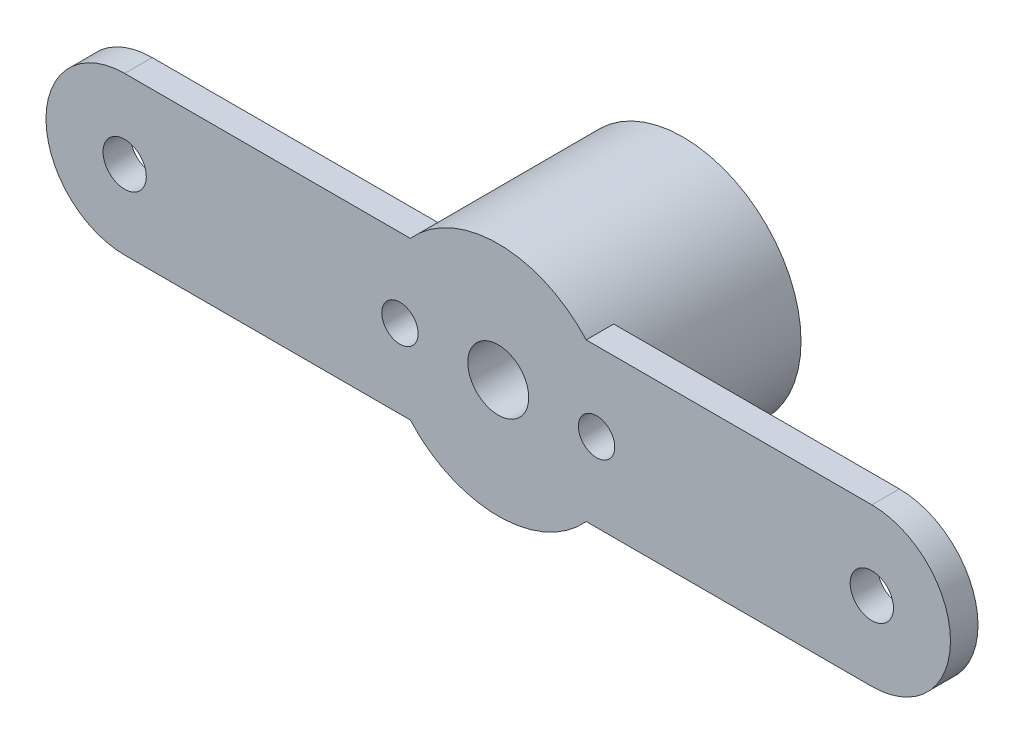
ISO-10303-21;
HEADER;
FILE_DESCRIPTION(('STEP AP214'),'2;1');
FILE_NAME('part.step','',(''),(''),'','','');
FILE_SCHEMA(('AUTOMOTIVE_DESIGN { 1 0 10303 214 1 1 1 1 }'));
ENDSEC;
DATA;
#1=APPLICATION_CONTEXT('core data for automotive mechanical design processes');
#2=APPLICATION_PROTOCOL_DEFINITION('international standard','automotive_design',2000,#1);
#3=PRODUCT_CONTEXT('',#1,'mechanical');
#4=PRODUCT('Part','Part','',(#3));
#5=PRODUCT_RELATED_PRODUCT_CATEGORY('part','',(#4));
#6=PRODUCT_DEFINITION_FORMATION('','',#4);
#7=PRODUCT_DEFINITION_CONTEXT('part definition',#1,'design');
#8=PRODUCT_DEFINITION('design','',#6,#7);
#9=PRODUCT_DEFINITION_SHAPE('','',#8);
#10=(LENGTH_UNIT() NAMED_UNIT(*) SI_UNIT(.MILLI.,.METRE.));
#11=(NAMED_UNIT(*) PLANE_ANGLE_UNIT() SI_UNIT($,.RADIAN.));
#12=(NAMED_UNIT(*) SI_UNIT($,.STERADIAN.) SOLID_ANGLE_UNIT());
#13=UNCERTAINTY_MEASURE_WITH_UNIT(LENGTH_MEASURE(1.E-05),#10,'distance_accuracy_value','');
#14=(GEOMETRIC_REPRESENTATION_CONTEXT(3) GLOBAL_UNCERTAINTY_ASSIGNED_CONTEXT((#13)) GLOBAL_UNIT_ASSIGNED_CONTEXT((#10,
#11,#12)) REPRESENTATION_CONTEXT('',''));
#15=CARTESIAN_POINT('',(0.,0.,0.));
#16=DIRECTION('',(0.,0.,1.));
#17=DIRECTION('',(1.,0.,0.));
#18=AXIS2_PLACEMENT_3D('',#15,#16,#17);
#19=CARTESIAN_POINT('',(-19.,0.,0.));
#20=DIRECTION('',(0.,0.,1.));
#21=DIRECTION('',(1.,0.,0.));
#22=AXIS2_PLACEMENT_3D('',#19,#20,#21);
#23=PLANE('',#22);
#24=CARTESIAN_POINT('',(0.,0.,0.));
#25=DIRECTION('',(0.,0.,-1.));
#26=DIRECTION('',(-1.,0.,0.));
#27=AXIS2_PLACEMENT_3D('',#24,#25,#26);
#28=CIRCLE('',#27,6.);
#29=CARTESIAN_POINT('',(4.47213595499958,4.,0.));
#30=VERTEX_POINT('',#29);
#31=CARTESIAN_POINT('',(4.47213595499958,-4.,0.));
#32=VERTEX_POINT('',#31);
#33=EDGE_CURVE('E11',#30,#32,#28,.T.);
#34=ORIENTED_EDGE('',*,*,#33,.F.);
#35=DIRECTION('',(-1.,0.,0.));
#36=VECTOR('',#35,1.);
#37=CARTESIAN_POINT('',(4.47213595499958,4.,0.));
#38=LINE('',#37,#36);
#39=CARTESIAN_POINT('',(19.,4.,0.));
#40=VERTEX_POINT('',#39);
#41=EDGE_CURVE('E127',#40,#30,#38,.T.);
#42=ORIENTED_EDGE('',*,*,#41,.F.);
#43=CARTESIAN_POINT('',(19.,0.,0.));
#44=DIRECTION('',(0.,0.,1.));
#45=DIRECTION('',(1.,0.,0.));
#46=AXIS2_PLACEMENT_3D('',#43,#44,#45);
#47=CIRCLE('',#46,4.);
#48=CARTESIAN_POINT('',(19.,-4.,0.));
#49=VERTEX_POINT('',#48);
#50=EDGE_CURVE('E144',#49,#40,#47,.T.);
#51=ORIENTED_EDGE('',*,*,#50,.F.);
#52=DIRECTION('',(1.,0.,0.));
#53=VECTOR('',#52,1.);
#54=CARTESIAN_POINT('',(4.47213595499958,-4.,0.));
#55=LINE('',#54,#53);
#56=EDGE_CURVE('E146',#32,#49,#55,.T.);
#57=ORIENTED_EDGE('',*,*,#56,.F.);
#58=EDGE_LOOP('',(#34,#42,#51,#57));
#59=FACE_BOUND('',#58,.T.);
#60=CARTESIAN_POINT('',(19.,0.,0.));
#61=DIRECTION('',(0.,0.,1.));
#62=DIRECTION('',(1.,0.,0.));
#63=AXIS2_PLACEMENT_3D('',#60,#61,#62);
#64=CIRCLE('',#63,1.1);
#65=CARTESIAN_POINT('',(20.1,0.,0.));
#66=VERTEX_POINT('',#65);
#67=EDGE_CURVE('E207',#66,#66,#64,.T.);
#68=ORIENTED_EDGE('',*,*,#67,.T.);
#69=EDGE_LOOP('',(#68));
#70=FACE_BOUND('',#69,.T.);
#71=ADVANCED_FACE('F37',(#59,#70),#23,.F.);
#72=CARTESIAN_POINT('',(-19.,0.,1.4));
#73=DIRECTION('',(0.,0.,1.));
#74=DIRECTION('',(1.,0.,0.));
#75=AXIS2_PLACEMENT_3D('',#72,#73,#74);
#76=PLANE('',#75);
#77=CARTESIAN_POINT('',(-5.,0.,1.4));
#78=DIRECTION('',(0.,0.,1.));
#79=DIRECTION('',(1.,0.,0.));
#80=AXIS2_PLACEMENT_3D('',#77,#78,#79);
#81=CIRCLE('',#80,0.925);
#82=CARTESIAN_POINT('',(-4.075,0.,1.4));
#83=VERTEX_POINT('',#82);
#84=EDGE_CURVE('E218',#83,#83,#81,.T.);
#85=ORIENTED_EDGE('',*,*,#84,.F.);
#86=EDGE_LOOP('',(#85));
#87=FACE_BOUND('',#86,.T.);
#88=CARTESIAN_POINT('',(19.,0.,1.4));
#89=DIRECTION('',(0.,0.,1.));
#90=DIRECTION('',(1.,0.,0.));
#91=AXIS2_PLACEMENT_3D('',#88,#89,#90);
#92=CIRCLE('',#91,1.1);
#93=CARTESIAN_POINT('',(20.1,0.,1.4));
#94=VERTEX_POINT('',#93);
#95=EDGE_CURVE('E209',#94,#94,#92,.T.);
#96=ORIENTED_EDGE('',*,*,#95,.F.);
#97=EDGE_LOOP('',(#96));
#98=FACE_BOUND('',#97,.T.);
#99=CARTESIAN_POINT('',(-19.,0.,1.4));
#100=DIRECTION('',(0.,0.,1.));
#101=DIRECTION('',(1.,0.,0.));
#102=AXIS2_PLACEMENT_3D('',#99,#100,#101);
#103=CIRCLE('',#102,4.);
#104=CARTESIAN_POINT('',(-19.,4.,1.4));
#105=VERTEX_POINT('',#104);
#106=CARTESIAN_POINT('',(-19.,-4.,1.4));
#107=VERTEX_POINT('',#106);
#108=EDGE_CURVE('E185',#105,#107,#103,.T.);
#109=ORIENTED_EDGE('',*,*,#108,.T.);
#110=DIRECTION('',(1.,0.,0.));
#111=VECTOR('',#110,1.);
#112=CARTESIAN_POINT('',(-19.,-4.,1.4));
#113=LINE('',#112,#111);
#114=CARTESIAN_POINT('',(-4.47213595499958,-4.,1.4));
#115=VERTEX_POINT('',#114);
#116=EDGE_CURVE('E97',#107,#115,#113,.T.);
#117=ORIENTED_EDGE('',*,*,#116,.T.);
#118=CARTESIAN_POINT('',(0.,0.,1.4));
#119=DIRECTION('',(0.,0.,1.));
#120=DIRECTION('',(1.,0.,0.));
#121=AXIS2_PLACEMENT_3D('',#118,#119,#120);
#122=CIRCLE('',#121,6.);
#123=CARTESIAN_POINT('',(4.47213595499958,-4.,1.4));
#124=VERTEX_POINT('',#123);
#125=EDGE_CURVE('E189',#115,#124,#122,.T.);
#126=ORIENTED_EDGE('',*,*,#125,.T.);
#127=DIRECTION('',(1.,0.,0.));
#128=VECTOR('',#127,1.);
#129=CARTESIAN_POINT('',(4.47213595499958,-4.,1.4));
#130=LINE('',#129,#128);
#131=CARTESIAN_POINT('',(19.,-4.,1.4));
#132=VERTEX_POINT('',#131);
#133=EDGE_CURVE('E195',#124,#132,#130,.T.);
#134=ORIENTED_EDGE('',*,*,#133,.T.);
#135=CARTESIAN_POINT('',(19.,0.,1.4));
#136=DIRECTION('',(0.,0.,1.));
#137=DIRECTION('',(1.,0.,0.));
#138=AXIS2_PLACEMENT_3D('',#135,#136,#137);
#139=CIRCLE('',#138,4.);
#140=CARTESIAN_POINT('',(19.,4.,1.4));
#141=VERTEX_POINT('',#140);
#142=EDGE_CURVE('E119',#132,#141,#139,.T.);
#143=ORIENTED_EDGE('',*,*,#142,.T.);
#144=DIRECTION('',(-1.,0.,0.));
#145=VECTOR('',#144,1.);
#146=CARTESIAN_POINT('',(4.47213595499958,4.,1.4));
#147=LINE('',#146,#145);
#148=CARTESIAN_POINT('',(4.47213595499958,4.,1.4));
#149=VERTEX_POINT('',#148);
#150=EDGE_CURVE('E111',#141,#149,#147,.T.);
#151=ORIENTED_EDGE('',*,*,#150,.T.);
#152=CARTESIAN_POINT('',(0.,0.,1.4));
#153=DIRECTION('',(0.,0.,1.));
#154=DIRECTION('',(1.,0.,0.));
#155=AXIS2_PLACEMENT_3D('',#152,#153,#154);
#156=CIRCLE('',#155,6.);
#157=CARTESIAN_POINT('',(-4.47213595499958,4.,1.4));
#158=VERTEX_POINT('',#157);
#159=EDGE_CURVE('E116',#149,#158,#156,.T.);
#160=ORIENTED_EDGE('',*,*,#159,.T.);
#161=DIRECTION('',(-1.,0.,0.));
#162=VECTOR('',#161,1.);
#163=CARTESIAN_POINT('',(-19.,4.,1.4));
#164=LINE('',#163,#162);
#165=EDGE_CURVE('E56',#158,#105,#164,.T.);
#166=ORIENTED_EDGE('',*,*,#165,.T.);
#167=EDGE_LOOP('',(#109,#117,#126,#134,#143,#151,#160,#166));
#168=FACE_BOUND('',#167,.T.);
#169=CARTESIAN_POINT('',(0.,0.,1.4));
#170=DIRECTION('',(0.,0.,1.));
#171=DIRECTION('',(1.,0.,0.));
#172=AXIS2_PLACEMENT_3D('',#169,#170,#171);
#173=CIRCLE('',#172,1.55);
#174=CARTESIAN_POINT('',(1.55,0.,1.4));
#175=VERTEX_POINT('',#174);
#176=EDGE_CURVE('E143',#175,#175,#173,.T.);
#177=ORIENTED_EDGE('',*,*,#176,.F.);
#178=EDGE_LOOP('',(#177));
#179=FACE_BOUND('',#178,.T.);
#180=CARTESIAN_POINT('',(-19.,0.,1.4));
#181=DIRECTION('',(0.,0.,1.));
#182=DIRECTION('',(1.,0.,0.));
#183=AXIS2_PLACEMENT_3D('',#180,#181,#182);
#184=CIRCLE('',#183,1.1);
#185=CARTESIAN_POINT('',(-17.9,0.,1.4));
#186=VERTEX_POINT('',#185);
#187=EDGE_CURVE('E210',#186,#186,#184,.T.);
#188=ORIENTED_EDGE('',*,*,#187,.F.);
#189=EDGE_LOOP('',(#188));
#190=FACE_BOUND('',#189,.T.);
#191=CARTESIAN_POINT('',(5.,0.,1.4));
#192=DIRECTION('',(0.,0.,1.));
#193=DIRECTION('',(1.,0.,0.));
#194=AXIS2_PLACEMENT_3D('',#191,#192,#193);
#195=CIRCLE('',#194,0.925);
#196=CARTESIAN_POINT('',(5.925,0.,1.4));
#197=VERTEX_POINT('',#196);
#198=EDGE_CURVE('E222',#197,#197,#195,.T.);
#199=ORIENTED_EDGE('',*,*,#198,.F.);
#200=EDGE_LOOP('',(#199));
#201=FACE_BOUND('',#200,.T.);
#202=ADVANCED_FACE('F113',(#87,#98,#168,#179,#190,#201),#76,.T.);
#203=CARTESIAN_POINT('',(-4.47213595499958,-4.,0.));
#204=VERTEX_POINT('',#203);
#205=CARTESIAN_POINT('',(-4.47213595499958,4.,0.));
#206=VERTEX_POINT('',#205);
#207=EDGE_CURVE('E47',#204,#206,#28,.T.);
#208=ORIENTED_EDGE('',*,*,#207,.F.);
#209=DIRECTION('',(1.,0.,0.));
#210=VECTOR('',#209,1.);
#211=CARTESIAN_POINT('',(-19.,-4.,0.));
#212=LINE('',#211,#210);
#213=CARTESIAN_POINT('',(-19.,-4.,0.));
#214=VERTEX_POINT('',#213);
#215=EDGE_CURVE('E142',#214,#204,#212,.T.);
#216=ORIENTED_EDGE('',*,*,#215,.F.);
#217=CARTESIAN_POINT('',(-19.,0.,0.));
#218=DIRECTION('',(0.,0.,1.));
#219=DIRECTION('',(1.,0.,0.));
#220=AXIS2_PLACEMENT_3D('',#217,#218,#219);
#221=CIRCLE('',#220,4.);
#222=CARTESIAN_POINT('',(-19.,4.,0.));
#223=VERTEX_POINT('',#222);
#224=EDGE_CURVE('E139',#223,#214,#221,.T.);
#225=ORIENTED_EDGE('',*,*,#224,.F.);
#226=DIRECTION('',(-1.,0.,0.));
#227=VECTOR('',#226,1.);
#228=CARTESIAN_POINT('',(-19.,4.,0.));
#229=LINE('',#228,#227);
#230=EDGE_CURVE('E88',#206,#223,#229,.T.);
#231=ORIENTED_EDGE('',*,*,#230,.F.);
#232=EDGE_LOOP('',(#208,#216,#225,#231));
#233=FACE_BOUND('',#232,.T.);
#234=CARTESIAN_POINT('',(-19.,0.,0.));
#235=DIRECTION('',(0.,0.,1.));
#236=DIRECTION('',(1.,0.,0.));
#237=AXIS2_PLACEMENT_3D('',#234,#235,#236);
#238=CIRCLE('',#237,1.1);
#239=CARTESIAN_POINT('',(-17.9,0.,0.));
#240=VERTEX_POINT('',#239);
#241=EDGE_CURVE('E214',#240,#240,#238,.T.);
#242=ORIENTED_EDGE('',*,*,#241,.T.);
#243=EDGE_LOOP('',(#242));
#244=FACE_BOUND('',#243,.T.);
#245=ADVANCED_FACE('F204',(#233,#244),#23,.F.);
#246=CARTESIAN_POINT('',(-19.,0.,1.4));
#247=DIRECTION('',(0.,0.,-1.));
#248=DIRECTION('',(-1.,0.,0.));
#249=AXIS2_PLACEMENT_3D('',#246,#247,#248);
#250=CYLINDRICAL_SURFACE('',#249,4.);
#251=ORIENTED_EDGE('',*,*,#224,.T.);
#252=DIRECTION('',(0.,0.,-1.));
#253=VECTOR('',#252,1.);
#254=CARTESIAN_POINT('',(-19.,-4.,1.4));
#255=LINE('',#254,#253);
#256=EDGE_CURVE('E153',#107,#214,#255,.T.);
#257=ORIENTED_EDGE('',*,*,#256,.F.);
#258=ORIENTED_EDGE('',*,*,#108,.F.);
#259=DIRECTION('',(0.,0.,-1.));
#260=VECTOR('',#259,1.);
#261=CARTESIAN_POINT('',(-19.,4.,1.4));
#262=LINE('',#261,#260);
#263=EDGE_CURVE('E135',#105,#223,#262,.T.);
#264=ORIENTED_EDGE('',*,*,#263,.T.);
#265=EDGE_LOOP('',(#251,#257,#258,#264));
#266=FACE_BOUND('',#265,.T.);
#267=ADVANCED_FACE('F39',(#266),#250,.T.);
#268=CARTESIAN_POINT('',(-19.,-4.,1.4));
#269=DIRECTION('',(0.,1.,0.));
#270=DIRECTION('',(0.,0.,1.));
#271=AXIS2_PLACEMENT_3D('',#268,#269,#270);
#272=PLANE('',#271);
#273=ORIENTED_EDGE('',*,*,#215,.T.);
#274=DIRECTION('',(0.,0.,-1.));
#275=VECTOR('',#274,1.);
#276=CARTESIAN_POINT('',(-4.47213595499958,-4.,1.4));
#277=LINE('',#276,#275);
#278=EDGE_CURVE('E155',#115,#204,#277,.T.);
#279=ORIENTED_EDGE('',*,*,#278,.F.);
#280=ORIENTED_EDGE('',*,*,#116,.F.);
#281=ORIENTED_EDGE('',*,*,#256,.T.);
#282=EDGE_LOOP('',(#273,#279,#280,#281));
#283=FACE_BOUND('',#282,.T.);
#284=ADVANCED_FACE('F283',(#283),#272,.F.);
#285=CARTESIAN_POINT('',(4.47213595499958,-4.,1.4));
#286=DIRECTION('',(0.,1.,0.));
#287=DIRECTION('',(0.,0.,1.));
#288=AXIS2_PLACEMENT_3D('',#285,#286,#287);
#289=PLANE('',#288);
#290=ORIENTED_EDGE('',*,*,#56,.T.);
#291=DIRECTION('',(0.,0.,-1.));
#292=VECTOR('',#291,1.);
#293=CARTESIAN_POINT('',(19.,-4.,1.4));
#294=LINE('',#293,#292);
#295=EDGE_CURVE('E149',#132,#49,#294,.T.);
#296=ORIENTED_EDGE('',*,*,#295,.F.);
#297=ORIENTED_EDGE('',*,*,#133,.F.);
#298=DIRECTION('',(0.,0.,-1.));
#299=VECTOR('',#298,1.);
#300=CARTESIAN_POINT('',(4.47213595499958,-4.,1.4));
#301=LINE('',#300,#299);
#302=EDGE_CURVE('E152',#124,#32,#301,.T.);
#303=ORIENTED_EDGE('',*,*,#302,.T.);
#304=EDGE_LOOP('',(#290,#296,#297,#303));
#305=FACE_BOUND('',#304,.T.);
#306=ADVANCED_FACE('F197',(#305),#289,.F.);
#307=CARTESIAN_POINT('',(19.,0.,1.4));
#308=DIRECTION('',(0.,0.,-1.));
#309=DIRECTION('',(-1.,0.,0.));
#310=AXIS2_PLACEMENT_3D('',#307,#308,#309);
#311=CYLINDRICAL_SURFACE('',#310,4.);
#312=ORIENTED_EDGE('',*,*,#50,.T.);
#313=DIRECTION('',(0.,0.,-1.));
#314=VECTOR('',#313,1.);
#315=CARTESIAN_POINT('',(19.,4.,1.4));
#316=LINE('',#315,#314);
#317=EDGE_CURVE('E129',#141,#40,#316,.T.);
#318=ORIENTED_EDGE('',*,*,#317,.F.);
#319=ORIENTED_EDGE('',*,*,#142,.F.);
#320=ORIENTED_EDGE('',*,*,#295,.T.);
#321=EDGE_LOOP('',(#312,#318,#319,#320));
#322=FACE_BOUND('',#321,.T.);
#323=ADVANCED_FACE('F200',(#322),#311,.T.);
#324=CARTESIAN_POINT('',(4.47213595499958,4.,1.4));
#325=DIRECTION('',(0.,-1.,0.));
#326=DIRECTION('',(1.,0.,0.));
#327=AXIS2_PLACEMENT_3D('',#324,#325,#326);
#328=PLANE('',#327);
#329=ORIENTED_EDGE('',*,*,#41,.T.);
#330=DIRECTION('',(0.,0.,-1.));
#331=VECTOR('',#330,1.);
#332=CARTESIAN_POINT('',(4.47213595499958,4.,1.4));
#333=LINE('',#332,#331);
#334=EDGE_CURVE('E125',#149,#30,#333,.T.);
#335=ORIENTED_EDGE('',*,*,#334,.F.);
#336=ORIENTED_EDGE('',*,*,#150,.F.);
#337=ORIENTED_EDGE('',*,*,#317,.T.);
#338=EDGE_LOOP('',(#329,#335,#336,#337));
#339=FACE_BOUND('',#338,.T.);
#340=ADVANCED_FACE('F126',(#339),#328,.F.);
#341=CARTESIAN_POINT('',(0.,0.,1.4));
#342=DIRECTION('',(0.,0.,-1.));
#343=DIRECTION('',(-1.,0.,0.));
#344=AXIS2_PLACEMENT_3D('',#341,#342,#343);
#345=CYLINDRICAL_SURFACE('',#344,6.);
#346=ORIENTED_EDGE('',*,*,#334,.T.);
#347=ORIENTED_EDGE('',*,*,#33,.T.);
#348=ORIENTED_EDGE('',*,*,#302,.F.);
#349=ORIENTED_EDGE('',*,*,#125,.F.);
#350=ORIENTED_EDGE('',*,*,#278,.T.);
#351=ORIENTED_EDGE('',*,*,#207,.T.);
#352=DIRECTION('',(0.,0.,-1.));
#353=VECTOR('',#352,1.);
#354=CARTESIAN_POINT('',(-4.47213595499958,4.,1.4));
#355=LINE('',#354,#353);
#356=EDGE_CURVE('E130',#158,#206,#355,.T.);
#357=ORIENTED_EDGE('',*,*,#356,.F.);
#358=ORIENTED_EDGE('',*,*,#159,.F.);
#359=EDGE_LOOP('',(#346,#347,#348,#349,#350,#351,#357,#358));
#360=FACE_BOUND('',#359,.T.);
#361=CARTESIAN_POINT('',(0.,0.,-8.));
#362=DIRECTION('',(0.,0.,-1.));
#363=DIRECTION('',(-1.,0.,0.));
#364=AXIS2_PLACEMENT_3D('',#361,#362,#363);
#365=CIRCLE('',#364,6.);
#366=CARTESIAN_POINT('',(-6.,0.,-8.));
#367=VERTEX_POINT('',#366);
#368=EDGE_CURVE('E225',#367,#367,#365,.T.);
#369=ORIENTED_EDGE('',*,*,#368,.F.);
#370=EDGE_LOOP('',(#369));
#371=FACE_BOUND('',#370,.T.);
#372=ADVANCED_FACE('F131',(#360,#371),#345,.T.);
#373=CARTESIAN_POINT('',(-19.,4.,1.4));
#374=DIRECTION('',(0.,-1.,0.));
#375=DIRECTION('',(0.,0.,-1.));
#376=AXIS2_PLACEMENT_3D('',#373,#374,#375);
#377=PLANE('',#376);
#378=ORIENTED_EDGE('',*,*,#230,.T.);
#379=ORIENTED_EDGE('',*,*,#263,.F.);
#380=ORIENTED_EDGE('',*,*,#165,.F.);
#381=ORIENTED_EDGE('',*,*,#356,.T.);
#382=EDGE_LOOP('',(#378,#379,#380,#381));
#383=FACE_BOUND('',#382,.T.);
#384=ADVANCED_FACE('F267',(#383),#377,.F.);
#385=CARTESIAN_POINT('',(0.,0.,1.4));
#386=DIRECTION('',(0.,0.,-1.));
#387=DIRECTION('',(-1.,0.,0.));
#388=AXIS2_PLACEMENT_3D('',#385,#386,#387);
#389=CYLINDRICAL_SURFACE('',#388,1.55);
#390=ORIENTED_EDGE('',*,*,#176,.T.);
#391=EDGE_LOOP('',(#390));
#392=FACE_BOUND('',#391,.T.);
#393=CARTESIAN_POINT('',(0.,0.,-8.));
#394=DIRECTION('',(0.,0.,-1.));
#395=DIRECTION('',(-1.,0.,0.));
#396=AXIS2_PLACEMENT_3D('',#393,#394,#395);
#397=CIRCLE('',#396,1.55);
#398=CARTESIAN_POINT('',(-1.55,0.,-8.));
#399=VERTEX_POINT('',#398);
#400=EDGE_CURVE('E228',#399,#399,#397,.T.);
#401=ORIENTED_EDGE('',*,*,#400,.T.);
#402=EDGE_LOOP('',(#401));
#403=FACE_BOUND('',#402,.T.);
#404=ADVANCED_FACE('F263',(#392,#403),#389,.F.);
#405=CARTESIAN_POINT('',(19.,0.,1.4));
#406=DIRECTION('',(0.,0.,-1.));
#407=DIRECTION('',(-1.,0.,0.));
#408=AXIS2_PLACEMENT_3D('',#405,#406,#407);
#409=CYLINDRICAL_SURFACE('',#408,1.1);
#410=ORIENTED_EDGE('',*,*,#95,.T.);
#411=EDGE_LOOP('',(#410));
#412=FACE_BOUND('',#411,.T.);
#413=ORIENTED_EDGE('',*,*,#67,.F.);
#414=EDGE_LOOP('',(#413));
#415=FACE_BOUND('',#414,.T.);
#416=ADVANCED_FACE('F259',(#412,#415),#409,.F.);
#417=CARTESIAN_POINT('',(-19.,0.,1.4));
#418=DIRECTION('',(0.,0.,-1.));
#419=DIRECTION('',(-1.,0.,0.));
#420=AXIS2_PLACEMENT_3D('',#417,#418,#419);
#421=CYLINDRICAL_SURFACE('',#420,1.1);
#422=ORIENTED_EDGE('',*,*,#187,.T.);
#423=EDGE_LOOP('',(#422));
#424=FACE_BOUND('',#423,.T.);
#425=ORIENTED_EDGE('',*,*,#241,.F.);
#426=EDGE_LOOP('',(#425));
#427=FACE_BOUND('',#426,.T.);
#428=ADVANCED_FACE('F255',(#424,#427),#421,.F.);
#429=CARTESIAN_POINT('',(-5.,0.,1.4));
#430=DIRECTION('',(0.,0.,-1.));
#431=DIRECTION('',(-1.,0.,0.));
#432=AXIS2_PLACEMENT_3D('',#429,#430,#431);
#433=CYLINDRICAL_SURFACE('',#432,0.925);
#434=ORIENTED_EDGE('',*,*,#84,.T.);
#435=EDGE_LOOP('',(#434));
#436=FACE_BOUND('',#435,.T.);
#437=CARTESIAN_POINT('',(-5.,0.,-8.));
#438=DIRECTION('',(0.,0.,-1.));
#439=DIRECTION('',(-1.,0.,0.));
#440=AXIS2_PLACEMENT_3D('',#437,#438,#439);
#441=CIRCLE('',#440,0.925);
#442=CARTESIAN_POINT('',(-5.925,0.,-8.));
#443=VERTEX_POINT('',#442);
#444=EDGE_CURVE('E234',#443,#443,#441,.T.);
#445=ORIENTED_EDGE('',*,*,#444,.T.);
#446=EDGE_LOOP('',(#445));
#447=FACE_BOUND('',#446,.T.);
#448=ADVANCED_FACE('F238',(#436,#447),#433,.F.);
#449=CARTESIAN_POINT('',(5.,0.,1.4));
#450=DIRECTION('',(0.,0.,-1.));
#451=DIRECTION('',(-1.,0.,0.));
#452=AXIS2_PLACEMENT_3D('',#449,#450,#451);
#453=CYLINDRICAL_SURFACE('',#452,0.925);
#454=ORIENTED_EDGE('',*,*,#198,.T.);
#455=EDGE_LOOP('',(#454));
#456=FACE_BOUND('',#455,.T.);
#457=CARTESIAN_POINT('',(5.,0.,-8.));
#458=DIRECTION('',(0.,0.,-1.));
#459=DIRECTION('',(-1.,0.,0.));
#460=AXIS2_PLACEMENT_3D('',#457,#458,#459);
#461=CIRCLE('',#460,0.925);
#462=CARTESIAN_POINT('',(4.075,0.,-8.));
#463=VERTEX_POINT('',#462);
#464=EDGE_CURVE('E231',#463,#463,#461,.T.);
#465=ORIENTED_EDGE('',*,*,#464,.T.);
#466=EDGE_LOOP('',(#465));
#467=FACE_BOUND('',#466,.T.);
#468=ADVANCED_FACE('F242',(#456,#467),#453,.F.);
#469=CARTESIAN_POINT('',(0.,0.,-8.));
#470=DIRECTION('',(0.,0.,-1.));
#471=DIRECTION('',(-1.,0.,0.));
#472=AXIS2_PLACEMENT_3D('',#469,#470,#471);
#473=PLANE('',#472);
#474=ORIENTED_EDGE('',*,*,#464,.F.);
#475=EDGE_LOOP('',(#474));
#476=FACE_BOUND('',#475,.T.);
#477=ORIENTED_EDGE('',*,*,#368,.T.);
#478=EDGE_LOOP('',(#477));
#479=FACE_BOUND('',#478,.T.);
#480=ORIENTED_EDGE('',*,*,#400,.F.);
#481=EDGE_LOOP('',(#480));
#482=FACE_BOUND('',#481,.T.);
#483=ORIENTED_EDGE('',*,*,#444,.F.);
#484=EDGE_LOOP('',(#483));
#485=FACE_BOUND('',#484,.T.);
#486=ADVANCED_FACE('F240',(#476,#479,#482,#485),#473,.T.);
#487=CLOSED_SHELL('',(#71,#202,#245,#267,#284,#306,#323,#340,#372,#384,#404,#416,#428,#448,#468,#486));
#488=MANIFOLD_SOLID_BREP('B2',#487);
#489=ADVANCED_BREP_SHAPE_REPRESENTATION('',(#18,#488),#14);
#490=SHAPE_DEFINITION_REPRESENTATION(#9,#489);
ENDSEC;
END-ISO-10303-21;
